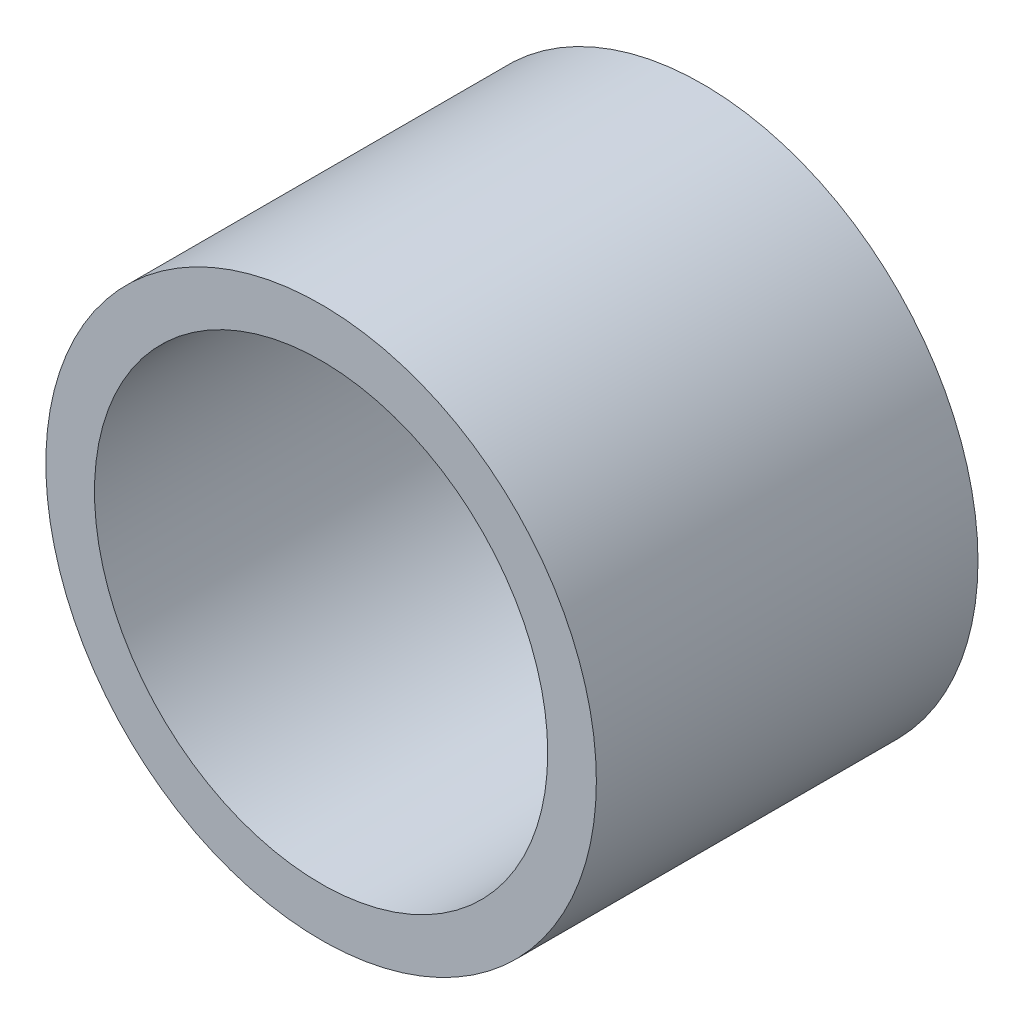
ISO-10303-21;
HEADER;
FILE_DESCRIPTION(('STEP AP214'),'2;1');
FILE_NAME('part.step','',(''),(''),'','','');
FILE_SCHEMA(('AUTOMOTIVE_DESIGN { 1 0 10303 214 1 1 1 1 }'));
ENDSEC;
DATA;
#1=APPLICATION_CONTEXT('core data for automotive mechanical design processes');
#2=APPLICATION_PROTOCOL_DEFINITION('international standard','automotive_design',2000,#1);
#3=PRODUCT_CONTEXT('',#1,'mechanical');
#4=PRODUCT('Part','Part','',(#3));
#5=PRODUCT_RELATED_PRODUCT_CATEGORY('part','',(#4));
#6=PRODUCT_DEFINITION_FORMATION('','',#4);
#7=PRODUCT_DEFINITION_CONTEXT('part definition',#1,'design');
#8=PRODUCT_DEFINITION('design','',#6,#7);
#9=PRODUCT_DEFINITION_SHAPE('','',#8);
#10=(LENGTH_UNIT() NAMED_UNIT(*) SI_UNIT(.MILLI.,.METRE.));
#11=(NAMED_UNIT(*) PLANE_ANGLE_UNIT() SI_UNIT($,.RADIAN.));
#12=(NAMED_UNIT(*) SI_UNIT($,.STERADIAN.) SOLID_ANGLE_UNIT());
#13=UNCERTAINTY_MEASURE_WITH_UNIT(LENGTH_MEASURE(1.E-05),#10,'distance_accuracy_value','');
#14=(GEOMETRIC_REPRESENTATION_CONTEXT(3) GLOBAL_UNCERTAINTY_ASSIGNED_CONTEXT((#13)) GLOBAL_UNIT_ASSIGNED_CONTEXT((#10,
#11,#12)) REPRESENTATION_CONTEXT('',''));
#15=CARTESIAN_POINT('',(0.,0.,0.));
#16=DIRECTION('',(0.,0.,1.));
#17=DIRECTION('',(1.,0.,0.));
#18=AXIS2_PLACEMENT_3D('',#15,#16,#17);
#19=CARTESIAN_POINT('',(0.,0.,21.9202));
#20=DIRECTION('',(0.,0.,-1.));
#21=DIRECTION('',(-1.,0.,0.));
#22=AXIS2_PLACEMENT_3D('',#19,#20,#21);
#23=CYLINDRICAL_SURFACE('',#22,15.8115);
#24=CARTESIAN_POINT('',(0.,0.,21.9202));
#25=DIRECTION('',(0.,0.,1.));
#26=DIRECTION('',(1.,0.,0.));
#27=AXIS2_PLACEMENT_3D('',#24,#25,#26);
#28=CIRCLE('',#27,15.8115);
#29=CARTESIAN_POINT('',(15.8115,0.,21.9202));
#30=VERTEX_POINT('',#29);
#31=EDGE_CURVE('E41',#30,#30,#28,.T.);
#32=ORIENTED_EDGE('',*,*,#31,.F.);
#33=EDGE_LOOP('',(#32));
#34=FACE_BOUND('',#33,.T.);
#35=CARTESIAN_POINT('',(0.,0.,0.));
#36=DIRECTION('',(0.,0.,1.));
#37=DIRECTION('',(1.,0.,0.));
#38=AXIS2_PLACEMENT_3D('',#35,#36,#37);
#39=CIRCLE('',#38,15.8115);
#40=CARTESIAN_POINT('',(15.8115,0.,0.));
#41=VERTEX_POINT('',#40);
#42=EDGE_CURVE('E45',#41,#41,#39,.T.);
#43=ORIENTED_EDGE('',*,*,#42,.T.);
#44=EDGE_LOOP('',(#43));
#45=FACE_BOUND('',#44,.T.);
#46=ADVANCED_FACE('F30',(#34,#45),#23,.T.);
#47=CARTESIAN_POINT('',(0.,0.,21.9202));
#48=DIRECTION('',(0.,0.,1.));
#49=DIRECTION('',(1.,0.,0.));
#50=AXIS2_PLACEMENT_3D('',#47,#48,#49);
#51=PLANE('',#50);
#52=CARTESIAN_POINT('',(0.,0.,21.9202));
#53=DIRECTION('',(0.,0.,1.));
#54=DIRECTION('',(1.,0.,0.));
#55=AXIS2_PLACEMENT_3D('',#52,#53,#54);
#56=CIRCLE('',#55,13.0175);
#57=CARTESIAN_POINT('',(13.0175,0.,21.9202));
#58=VERTEX_POINT('',#57);
#59=EDGE_CURVE('E49',#58,#58,#56,.T.);
#60=ORIENTED_EDGE('',*,*,#59,.F.);
#61=EDGE_LOOP('',(#60));
#62=FACE_BOUND('',#61,.T.);
#63=ORIENTED_EDGE('',*,*,#31,.T.);
#64=EDGE_LOOP('',(#63));
#65=FACE_BOUND('',#64,.T.);
#66=ADVANCED_FACE('F56',(#62,#65),#51,.T.);
#67=CARTESIAN_POINT('',(0.,0.,0.));
#68=DIRECTION('',(0.,0.,1.));
#69=DIRECTION('',(1.,0.,0.));
#70=AXIS2_PLACEMENT_3D('',#67,#68,#69);
#71=PLANE('',#70);
#72=ORIENTED_EDGE('',*,*,#42,.F.);
#73=EDGE_LOOP('',(#72));
#74=FACE_BOUND('',#73,.T.);
#75=ADVANCED_FACE('F59',(#74),#71,.F.);
#76=CARTESIAN_POINT('',(0.,0.,2.5908));
#77=DIRECTION('',(0.,0.,1.));
#78=DIRECTION('',(1.,0.,0.));
#79=AXIS2_PLACEMENT_3D('',#76,#77,#78);
#80=CYLINDRICAL_SURFACE('',#79,13.0175);
#81=CARTESIAN_POINT('',(0.,0.,2.9083));
#82=DIRECTION('',(0.,0.,1.));
#83=DIRECTION('',(1.,0.,0.));
#84=AXIS2_PLACEMENT_3D('',#81,#82,#83);
#85=CIRCLE('',#84,13.0175);
#86=CARTESIAN_POINT('',(13.0175,0.,2.9083));
#87=VERTEX_POINT('',#86);
#88=EDGE_CURVE('E10',#87,#87,#85,.F.);
#89=ORIENTED_EDGE('',*,*,#88,.T.);
#90=EDGE_LOOP('',(#89));
#91=FACE_BOUND('',#90,.T.);
#92=ORIENTED_EDGE('',*,*,#59,.T.);
#93=EDGE_LOOP('',(#92));
#94=FACE_BOUND('',#93,.T.);
#95=ADVANCED_FACE('F54',(#91,#94),#80,.F.);
#96=CARTESIAN_POINT('',(0.,0.,2.5908));
#97=DIRECTION('',(0.,0.,1.));
#98=DIRECTION('',(1.,0.,0.));
#99=AXIS2_PLACEMENT_3D('',#96,#97,#98);
#100=PLANE('',#99);
#101=CARTESIAN_POINT('',(0.,0.,2.5908));
#102=DIRECTION('',(0.,0.,1.));
#103=DIRECTION('',(1.,0.,0.));
#104=AXIS2_PLACEMENT_3D('',#101,#102,#103);
#105=CIRCLE('',#104,12.7);
#106=CARTESIAN_POINT('',(12.7,0.,2.5908));
#107=VERTEX_POINT('',#106);
#108=EDGE_CURVE('E37',#107,#107,#105,.T.);
#109=ORIENTED_EDGE('',*,*,#108,.T.);
#110=EDGE_LOOP('',(#109));
#111=FACE_BOUND('',#110,.T.);
#112=ADVANCED_FACE('F72',(#111),#100,.T.);
#113=CARTESIAN_POINT('',(0.,0.,2.9083));
#114=DIRECTION('',(0.,0.,1.));
#115=DIRECTION('',(1.,0.,0.));
#116=AXIS2_PLACEMENT_3D('',#113,#114,#115);
#117=TOROIDAL_SURFACE('',#116,12.7,0.3175);
#118=ORIENTED_EDGE('',*,*,#88,.F.);
#119=EDGE_LOOP('',(#118));
#120=FACE_BOUND('',#119,.T.);
#121=ORIENTED_EDGE('',*,*,#108,.F.);
#122=EDGE_LOOP('',(#121));
#123=FACE_BOUND('',#122,.T.);
#124=ADVANCED_FACE('F32',(#120,#123),#117,.F.);
#125=CLOSED_SHELL('',(#46,#66,#75,#95,#112,#124));
#126=MANIFOLD_SOLID_BREP('B2',#125);
#127=ADVANCED_BREP_SHAPE_REPRESENTATION('',(#18,#126),#14);
#128=SHAPE_DEFINITION_REPRESENTATION(#9,#127);
ENDSEC;
END-ISO-10303-21;
